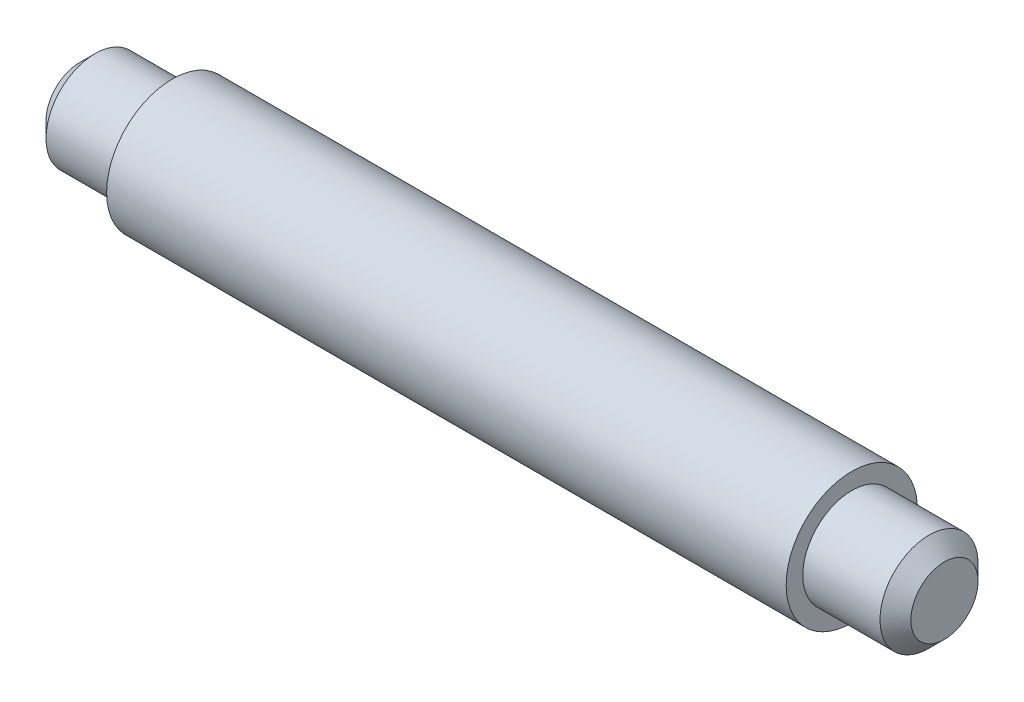
ISO-10303-21;
HEADER;
FILE_DESCRIPTION(('STEP AP214'),'2;1');
FILE_NAME('part.step','',(''),(''),'','','');
FILE_SCHEMA(('AUTOMOTIVE_DESIGN { 1 0 10303 214 1 1 1 1 }'));
ENDSEC;
DATA;
#1=APPLICATION_CONTEXT('core data for automotive mechanical design processes');
#2=APPLICATION_PROTOCOL_DEFINITION('international standard','automotive_design',2000,#1);
#3=PRODUCT_CONTEXT('',#1,'mechanical');
#4=PRODUCT('Part','Part','',(#3));
#5=PRODUCT_RELATED_PRODUCT_CATEGORY('part','',(#4));
#6=PRODUCT_DEFINITION_FORMATION('','',#4);
#7=PRODUCT_DEFINITION_CONTEXT('part definition',#1,'design');
#8=PRODUCT_DEFINITION('design','',#6,#7);
#9=PRODUCT_DEFINITION_SHAPE('','',#8);
#10=(LENGTH_UNIT() NAMED_UNIT(*) SI_UNIT(.MILLI.,.METRE.));
#11=(NAMED_UNIT(*) PLANE_ANGLE_UNIT() SI_UNIT($,.RADIAN.));
#12=(NAMED_UNIT(*) SI_UNIT($,.STERADIAN.) SOLID_ANGLE_UNIT());
#13=UNCERTAINTY_MEASURE_WITH_UNIT(LENGTH_MEASURE(1.E-05),#10,'distance_accuracy_value','');
#14=(GEOMETRIC_REPRESENTATION_CONTEXT(3) GLOBAL_UNCERTAINTY_ASSIGNED_CONTEXT((#13)) GLOBAL_UNIT_ASSIGNED_CONTEXT((#10,
#11,#12)) REPRESENTATION_CONTEXT('',''));
#15=CARTESIAN_POINT('',(0.,0.,0.));
#16=DIRECTION('',(0.,0.,1.));
#17=DIRECTION('',(1.,0.,0.));
#18=AXIS2_PLACEMENT_3D('',#15,#16,#17);
#19=CARTESIAN_POINT('',(-28.,0.,0.));
#20=DIRECTION('',(1.,0.,0.));
#21=DIRECTION('',(0.,0.,-1.));
#22=AXIS2_PLACEMENT_3D('',#19,#20,#21);
#23=PLANE('',#22);
#24=CARTESIAN_POINT('',(-28.,0.,0.));
#25=DIRECTION('',(-1.,0.,0.));
#26=DIRECTION('',(0.,0.,1.));
#27=AXIS2_PLACEMENT_3D('',#24,#25,#26);
#28=CIRCLE('',#27,2.17499999999997);
#29=CARTESIAN_POINT('',(-28.,0.,2.17499999999997));
#30=VERTEX_POINT('',#29);
#31=EDGE_CURVE('E10',#30,#30,#28,.T.);
#32=ORIENTED_EDGE('',*,*,#31,.T.);
#33=EDGE_LOOP('',(#32));
#34=FACE_BOUND('',#33,.T.);
#35=ADVANCED_FACE('F35',(#34),#23,.F.);
#36=CARTESIAN_POINT('',(-27.,0.,0.));
#37=DIRECTION('',(1.,0.,0.));
#38=DIRECTION('',(0.,0.,-1.));
#39=AXIS2_PLACEMENT_3D('',#36,#37,#38);
#40=CONICAL_SURFACE('',#39,3.175,0.785398163397461);
#41=ORIENTED_EDGE('',*,*,#31,.F.);
#42=EDGE_LOOP('',(#41));
#43=FACE_BOUND('',#42,.T.);
#44=CARTESIAN_POINT('',(-27.,0.,0.));
#45=DIRECTION('',(-1.,0.,0.));
#46=DIRECTION('',(0.,0.,1.));
#47=AXIS2_PLACEMENT_3D('',#44,#45,#46);
#48=CIRCLE('',#47,3.175);
#49=CARTESIAN_POINT('',(-27.,0.,3.175));
#50=VERTEX_POINT('',#49);
#51=EDGE_CURVE('E41',#50,#50,#48,.T.);
#52=ORIENTED_EDGE('',*,*,#51,.T.);
#53=EDGE_LOOP('',(#52));
#54=FACE_BOUND('',#53,.T.);
#55=ADVANCED_FACE('F79',(#43,#54),#40,.T.);
#56=CARTESIAN_POINT('',(-36.1764705882358,0.,0.));
#57=DIRECTION('',(-1.,0.,0.));
#58=DIRECTION('',(0.,0.,1.));
#59=AXIS2_PLACEMENT_3D('',#56,#57,#58);
#60=CYLINDRICAL_SURFACE('',#59,3.175);
#61=ORIENTED_EDGE('',*,*,#51,.F.);
#62=EDGE_LOOP('',(#61));
#63=FACE_BOUND('',#62,.T.);
#64=CARTESIAN_POINT('',(-22.,0.,0.));
#65=DIRECTION('',(-1.,0.,0.));
#66=DIRECTION('',(0.,0.,1.));
#67=AXIS2_PLACEMENT_3D('',#64,#65,#66);
#68=CIRCLE('',#67,3.175);
#69=CARTESIAN_POINT('',(-22.,0.,3.175));
#70=VERTEX_POINT('',#69);
#71=EDGE_CURVE('E45',#70,#70,#68,.T.);
#72=ORIENTED_EDGE('',*,*,#71,.T.);
#73=EDGE_LOOP('',(#72));
#74=FACE_BOUND('',#73,.T.);
#75=ADVANCED_FACE('F83',(#63,#74),#60,.T.);
#76=CARTESIAN_POINT('',(-22.,3.175,0.));
#77=DIRECTION('',(1.,0.,0.));
#78=DIRECTION('',(0.,0.,-1.));
#79=AXIS2_PLACEMENT_3D('',#76,#77,#78);
#80=PLANE('',#79);
#81=ORIENTED_EDGE('',*,*,#71,.F.);
#82=EDGE_LOOP('',(#81));
#83=FACE_BOUND('',#82,.T.);
#84=CARTESIAN_POINT('',(-22.,0.,0.));
#85=DIRECTION('',(-1.,0.,0.));
#86=DIRECTION('',(0.,0.,1.));
#87=AXIS2_PLACEMENT_3D('',#84,#85,#86);
#88=CIRCLE('',#87,4.25);
#89=CARTESIAN_POINT('',(-22.,0.,4.25));
#90=VERTEX_POINT('',#89);
#91=EDGE_CURVE('E49',#90,#90,#88,.T.);
#92=ORIENTED_EDGE('',*,*,#91,.T.);
#93=EDGE_LOOP('',(#92));
#94=FACE_BOUND('',#93,.T.);
#95=ADVANCED_FACE('F88',(#83,#94),#80,.F.);
#96=CARTESIAN_POINT('',(-36.1764705882358,0.,0.));
#97=DIRECTION('',(-1.,0.,0.));
#98=DIRECTION('',(0.,0.,1.));
#99=AXIS2_PLACEMENT_3D('',#96,#97,#98);
#100=CYLINDRICAL_SURFACE('',#99,4.25);
#101=ORIENTED_EDGE('',*,*,#91,.F.);
#102=EDGE_LOOP('',(#101));
#103=FACE_BOUND('',#102,.T.);
#104=CARTESIAN_POINT('',(22.,0.,0.));
#105=DIRECTION('',(-1.,0.,0.));
#106=DIRECTION('',(0.,0.,1.));
#107=AXIS2_PLACEMENT_3D('',#104,#105,#106);
#108=CIRCLE('',#107,4.25);
#109=CARTESIAN_POINT('',(22.,0.,4.25));
#110=VERTEX_POINT('',#109);
#111=EDGE_CURVE('E54',#110,#110,#108,.T.);
#112=ORIENTED_EDGE('',*,*,#111,.T.);
#113=EDGE_LOOP('',(#112));
#114=FACE_BOUND('',#113,.T.);
#115=ADVANCED_FACE('F94',(#103,#114),#100,.T.);
#116=CARTESIAN_POINT('',(22.,4.25,0.));
#117=DIRECTION('',(-1.,0.,0.));
#118=DIRECTION('',(0.,0.,1.));
#119=AXIS2_PLACEMENT_3D('',#116,#117,#118);
#120=PLANE('',#119);
#121=ORIENTED_EDGE('',*,*,#111,.F.);
#122=EDGE_LOOP('',(#121));
#123=FACE_BOUND('',#122,.T.);
#124=CARTESIAN_POINT('',(22.,0.,0.));
#125=DIRECTION('',(-1.,0.,0.));
#126=DIRECTION('',(0.,0.,1.));
#127=AXIS2_PLACEMENT_3D('',#124,#125,#126);
#128=CIRCLE('',#127,3.175);
#129=CARTESIAN_POINT('',(22.,0.,3.175));
#130=VERTEX_POINT('',#129);
#131=EDGE_CURVE('E57',#130,#130,#128,.T.);
#132=ORIENTED_EDGE('',*,*,#131,.T.);
#133=EDGE_LOOP('',(#132));
#134=FACE_BOUND('',#133,.T.);
#135=ADVANCED_FACE('F98',(#123,#134),#120,.F.);
#136=CARTESIAN_POINT('',(-36.1764705882358,0.,0.));
#137=DIRECTION('',(-1.,0.,0.));
#138=DIRECTION('',(0.,0.,1.));
#139=AXIS2_PLACEMENT_3D('',#136,#137,#138);
#140=CYLINDRICAL_SURFACE('',#139,3.175);
#141=ORIENTED_EDGE('',*,*,#131,.F.);
#142=EDGE_LOOP('',(#141));
#143=FACE_BOUND('',#142,.T.);
#144=CARTESIAN_POINT('',(26.9999999999999,0.,0.));
#145=DIRECTION('',(-1.,0.,0.));
#146=DIRECTION('',(0.,0.,1.));
#147=AXIS2_PLACEMENT_3D('',#144,#145,#146);
#148=CIRCLE('',#147,3.175);
#149=CARTESIAN_POINT('',(26.9999999999999,0.,3.175));
#150=VERTEX_POINT('',#149);
#151=EDGE_CURVE('E60',#150,#150,#148,.T.);
#152=ORIENTED_EDGE('',*,*,#151,.T.);
#153=EDGE_LOOP('',(#152));
#154=FACE_BOUND('',#153,.T.);
#155=ADVANCED_FACE('F75',(#143,#154),#140,.T.);
#156=CARTESIAN_POINT('',(28.,0.,0.));
#157=DIRECTION('',(-1.,0.,0.));
#158=DIRECTION('',(0.,0.,1.));
#159=AXIS2_PLACEMENT_3D('',#156,#157,#158);
#160=CONICAL_SURFACE('',#159,2.17499999999998,0.785398163397429);
#161=ORIENTED_EDGE('',*,*,#151,.F.);
#162=EDGE_LOOP('',(#161));
#163=FACE_BOUND('',#162,.T.);
#164=CARTESIAN_POINT('',(28.,0.,0.));
#165=DIRECTION('',(-1.,0.,0.));
#166=DIRECTION('',(0.,0.,1.));
#167=AXIS2_PLACEMENT_3D('',#164,#165,#166);
#168=CIRCLE('',#167,2.17499999999998);
#169=CARTESIAN_POINT('',(28.,0.,2.17499999999998));
#170=VERTEX_POINT('',#169);
#171=EDGE_CURVE('E63',#170,#170,#168,.T.);
#172=ORIENTED_EDGE('',*,*,#171,.T.);
#173=EDGE_LOOP('',(#172));
#174=FACE_BOUND('',#173,.T.);
#175=ADVANCED_FACE('F67',(#163,#174),#160,.T.);
#176=CARTESIAN_POINT('',(28.,2.17499999999998,0.));
#177=DIRECTION('',(-1.,0.,0.));
#178=DIRECTION('',(0.,0.,1.));
#179=AXIS2_PLACEMENT_3D('',#176,#177,#178);
#180=PLANE('',#179);
#181=ORIENTED_EDGE('',*,*,#171,.F.);
#182=EDGE_LOOP('',(#181));
#183=FACE_BOUND('',#182,.T.);
#184=ADVANCED_FACE('F69',(#183),#180,.F.);
#185=CLOSED_SHELL('',(#35,#55,#75,#95,#115,#135,#155,#175,#184));
#186=MANIFOLD_SOLID_BREP('B2',#185);
#187=ADVANCED_BREP_SHAPE_REPRESENTATION('',(#18,#186),#14);
#188=SHAPE_DEFINITION_REPRESENTATION(#9,#187);
ENDSEC;
END-ISO-10303-21;
